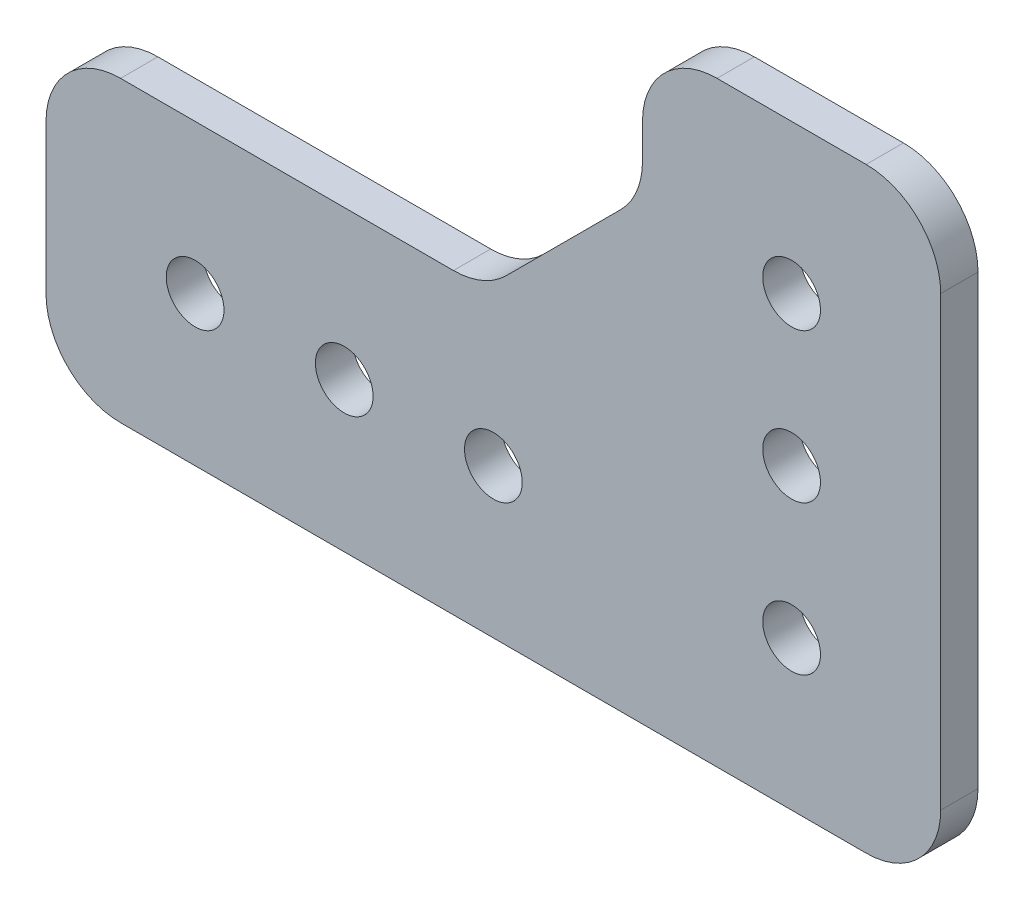
ISO-10303-21;
HEADER;
FILE_DESCRIPTION(('STEP AP214'),'2;1');
FILE_NAME('part.step','',(''),(''),'','','');
FILE_SCHEMA(('AUTOMOTIVE_DESIGN { 1 0 10303 214 1 1 1 1 }'));
ENDSEC;
DATA;
#1=APPLICATION_CONTEXT('core data for automotive mechanical design processes');
#2=APPLICATION_PROTOCOL_DEFINITION('international standard','automotive_design',2000,#1);
#3=PRODUCT_CONTEXT('',#1,'mechanical');
#4=PRODUCT('Part','Part','',(#3));
#5=PRODUCT_RELATED_PRODUCT_CATEGORY('part','',(#4));
#6=PRODUCT_DEFINITION_FORMATION('','',#4);
#7=PRODUCT_DEFINITION_CONTEXT('part definition',#1,'design');
#8=PRODUCT_DEFINITION('design','',#6,#7);
#9=PRODUCT_DEFINITION_SHAPE('','',#8);
#10=(LENGTH_UNIT() NAMED_UNIT(*) SI_UNIT(.MILLI.,.METRE.));
#11=(NAMED_UNIT(*) PLANE_ANGLE_UNIT() SI_UNIT($,.RADIAN.));
#12=(NAMED_UNIT(*) SI_UNIT($,.STERADIAN.) SOLID_ANGLE_UNIT());
#13=UNCERTAINTY_MEASURE_WITH_UNIT(LENGTH_MEASURE(1.E-05),#10,'distance_accuracy_value','');
#14=(GEOMETRIC_REPRESENTATION_CONTEXT(3) GLOBAL_UNCERTAINTY_ASSIGNED_CONTEXT((#13)) GLOBAL_UNIT_ASSIGNED_CONTEXT((#10,
#11,#12)) REPRESENTATION_CONTEXT('',''));
#15=CARTESIAN_POINT('',(0.,0.,0.));
#16=DIRECTION('',(0.,0.,1.));
#17=DIRECTION('',(1.,0.,0.));
#18=AXIS2_PLACEMENT_3D('',#15,#16,#17);
#19=CARTESIAN_POINT('',(-76.2,0.,3.175));
#20=DIRECTION('',(0.,1.,0.));
#21=DIRECTION('',(0.,0.,1.));
#22=AXIS2_PLACEMENT_3D('',#19,#20,#21);
#23=PLANE('',#22);
#24=DIRECTION('',(1.,0.,0.));
#25=VECTOR('',#24,1.);
#26=CARTESIAN_POINT('',(-76.2,0.,3.175));
#27=LINE('',#26,#25);
#28=CARTESIAN_POINT('',(-69.85,0.,3.175));
#29=VERTEX_POINT('',#28);
#30=CARTESIAN_POINT('',(-6.35000000000002,0.,3.175));
#31=VERTEX_POINT('',#30);
#32=EDGE_CURVE('E178',#29,#31,#27,.T.);
#33=ORIENTED_EDGE('',*,*,#32,.F.);
#34=DIRECTION('',(0.,0.,-1.));
#35=VECTOR('',#34,1.);
#36=CARTESIAN_POINT('',(-69.85,0.,3.175));
#37=LINE('',#36,#35);
#38=CARTESIAN_POINT('',(-69.85,0.,0.));
#39=VERTEX_POINT('',#38);
#40=EDGE_CURVE('E237',#29,#39,#37,.T.);
#41=ORIENTED_EDGE('',*,*,#40,.T.);
#42=DIRECTION('',(1.,0.,0.));
#43=VECTOR('',#42,1.);
#44=CARTESIAN_POINT('',(-76.2,0.,0.));
#45=LINE('',#44,#43);
#46=CARTESIAN_POINT('',(-6.35000000000002,0.,0.));
#47=VERTEX_POINT('',#46);
#48=EDGE_CURVE('E288',#39,#47,#45,.T.);
#49=ORIENTED_EDGE('',*,*,#48,.T.);
#50=DIRECTION('',(0.,0.,-1.));
#51=VECTOR('',#50,1.);
#52=CARTESIAN_POINT('',(-6.34999999999999,0.,3.175));
#53=LINE('',#52,#51);
#54=EDGE_CURVE('E234',#47,#31,#53,.F.);
#55=ORIENTED_EDGE('',*,*,#54,.T.);
#56=EDGE_LOOP('',(#33,#41,#49,#55));
#57=FACE_BOUND('',#56,.T.);
#58=ADVANCED_FACE('F39',(#57),#23,.F.);
#59=CARTESIAN_POINT('',(0.,0.,3.175));
#60=DIRECTION('',(-1.,0.,0.));
#61=DIRECTION('',(0.,0.,1.));
#62=AXIS2_PLACEMENT_3D('',#59,#60,#61);
#63=PLANE('',#62);
#64=DIRECTION('',(0.,1.,0.));
#65=VECTOR('',#64,1.);
#66=CARTESIAN_POINT('',(0.,0.,3.175));
#67=LINE('',#66,#65);
#68=CARTESIAN_POINT('',(0.,6.35,3.175));
#69=VERTEX_POINT('',#68);
#70=CARTESIAN_POINT('',(0.,44.45,3.175));
#71=VERTEX_POINT('',#70);
#72=EDGE_CURVE('E304',#69,#71,#67,.T.);
#73=ORIENTED_EDGE('',*,*,#72,.F.);
#74=DIRECTION('',(0.,0.,-1.));
#75=VECTOR('',#74,1.);
#76=CARTESIAN_POINT('',(0.,6.35,3.175));
#77=LINE('',#76,#75);
#78=CARTESIAN_POINT('',(0.,6.35,0.));
#79=VERTEX_POINT('',#78);
#80=EDGE_CURVE('E244',#69,#79,#77,.T.);
#81=ORIENTED_EDGE('',*,*,#80,.T.);
#82=DIRECTION('',(0.,1.,0.));
#83=VECTOR('',#82,1.);
#84=CARTESIAN_POINT('',(0.,0.,0.));
#85=LINE('',#84,#83);
#86=CARTESIAN_POINT('',(0.,44.45,0.));
#87=VERTEX_POINT('',#86);
#88=EDGE_CURVE('E292',#79,#87,#85,.T.);
#89=ORIENTED_EDGE('',*,*,#88,.T.);
#90=DIRECTION('',(0.,0.,-1.));
#91=VECTOR('',#90,1.);
#92=CARTESIAN_POINT('',(0.,44.45,3.175));
#93=LINE('',#92,#91);
#94=EDGE_CURVE('E241',#87,#71,#93,.F.);
#95=ORIENTED_EDGE('',*,*,#94,.T.);
#96=EDGE_LOOP('',(#73,#81,#89,#95));
#97=FACE_BOUND('',#96,.T.);
#98=ADVANCED_FACE('F390',(#97),#63,.F.);
#99=CARTESIAN_POINT('',(0.,50.8,3.175));
#100=DIRECTION('',(0.,-1.,0.));
#101=DIRECTION('',(0.,0.,-1.));
#102=AXIS2_PLACEMENT_3D('',#99,#100,#101);
#103=PLANE('',#102);
#104=DIRECTION('',(-1.,0.,0.));
#105=VECTOR('',#104,1.);
#106=CARTESIAN_POINT('',(0.,50.8,3.175));
#107=LINE('',#106,#105);
#108=CARTESIAN_POINT('',(-6.35,50.8,3.175));
#109=VERTEX_POINT('',#108);
#110=CARTESIAN_POINT('',(-19.05,50.8,3.175));
#111=VERTEX_POINT('',#110);
#112=EDGE_CURVE('E281',#109,#111,#107,.T.);
#113=ORIENTED_EDGE('',*,*,#112,.F.);
#114=DIRECTION('',(0.,0.,-1.));
#115=VECTOR('',#114,1.);
#116=CARTESIAN_POINT('',(-6.35,50.8,3.175));
#117=LINE('',#116,#115);
#118=CARTESIAN_POINT('',(-6.35,50.8,0.));
#119=VERTEX_POINT('',#118);
#120=EDGE_CURVE('E154',#109,#119,#117,.T.);
#121=ORIENTED_EDGE('',*,*,#120,.T.);
#122=DIRECTION('',(-1.,0.,0.));
#123=VECTOR('',#122,1.);
#124=CARTESIAN_POINT('',(0.,50.8,0.));
#125=LINE('',#124,#123);
#126=CARTESIAN_POINT('',(-19.05,50.8,0.));
#127=VERTEX_POINT('',#126);
#128=EDGE_CURVE('E266',#119,#127,#125,.T.);
#129=ORIENTED_EDGE('',*,*,#128,.T.);
#130=DIRECTION('',(0.,0.,-1.));
#131=VECTOR('',#130,1.);
#132=CARTESIAN_POINT('',(-19.05,50.8,3.175));
#133=LINE('',#132,#131);
#134=EDGE_CURVE('E55',#127,#111,#133,.F.);
#135=ORIENTED_EDGE('',*,*,#134,.T.);
#136=EDGE_LOOP('',(#113,#121,#129,#135));
#137=FACE_BOUND('',#136,.T.);
#138=ADVANCED_FACE('F299',(#137),#103,.F.);
#139=CARTESIAN_POINT('',(-25.4,50.8,3.175));
#140=DIRECTION('',(1.,0.,0.));
#141=DIRECTION('',(0.,1.,0.));
#142=AXIS2_PLACEMENT_3D('',#139,#140,#141);
#143=PLANE('',#142);
#144=DIRECTION('',(0.,-1.,0.));
#145=VECTOR('',#144,1.);
#146=CARTESIAN_POINT('',(-25.4,50.8,0.));
#147=LINE('',#146,#145);
#148=CARTESIAN_POINT('',(-25.4,44.45,0.));
#149=VERTEX_POINT('',#148);
#150=CARTESIAN_POINT('',(-25.4,41.5006403026729,0.));
#151=VERTEX_POINT('',#150);
#152=EDGE_CURVE('E180',#149,#151,#147,.T.);
#153=ORIENTED_EDGE('',*,*,#152,.T.);
#154=DIRECTION('',(0.,0.,-1.));
#155=VECTOR('',#154,1.);
#156=CARTESIAN_POINT('',(-25.4,41.5006403026729,3.175));
#157=LINE('',#156,#155);
#158=CARTESIAN_POINT('',(-25.4,41.5006403026729,3.175));
#159=VERTEX_POINT('',#158);
#160=EDGE_CURVE('E196',#151,#159,#157,.F.);
#161=ORIENTED_EDGE('',*,*,#160,.T.);
#162=DIRECTION('',(0.,-1.,0.));
#163=VECTOR('',#162,1.);
#164=CARTESIAN_POINT('',(-25.4,50.8,3.175));
#165=LINE('',#164,#163);
#166=CARTESIAN_POINT('',(-25.4,44.45,3.175));
#167=VERTEX_POINT('',#166);
#168=EDGE_CURVE('E273',#167,#159,#165,.T.);
#169=ORIENTED_EDGE('',*,*,#168,.F.);
#170=DIRECTION('',(0.,0.,-1.));
#171=VECTOR('',#170,1.);
#172=CARTESIAN_POINT('',(-25.4,44.45,3.175));
#173=LINE('',#172,#171);
#174=EDGE_CURVE('E192',#167,#149,#173,.T.);
#175=ORIENTED_EDGE('',*,*,#174,.T.);
#176=EDGE_LOOP('',(#153,#161,#169,#175));
#177=FACE_BOUND('',#176,.T.);
#178=ADVANCED_FACE('F261',(#177),#143,.F.);
#179=CARTESIAN_POINT('',(-25.4,38.8703841816037,3.175));
#180=DIRECTION('',(0.707106781186546,-0.707106781186549,0.));
#181=DIRECTION('',(0.707106781186549,0.707106781186546,0.));
#182=AXIS2_PLACEMENT_3D('',#179,#180,#181);
#183=PLANE('',#182);
#184=DIRECTION('',(-0.707106781186549,-0.707106781186546,0.));
#185=VECTOR('',#184,1.);
#186=CARTESIAN_POINT('',(-25.4,38.8703841816037,0.));
#187=LINE('',#186,#185);
#188=CARTESIAN_POINT('',(-27.2598719394654,37.0105122421383,0.));
#189=VERTEX_POINT('',#188);
#190=CARTESIAN_POINT('',(-37.0105122421383,27.2598719394654,0.));
#191=VERTEX_POINT('',#190);
#192=EDGE_CURVE('E173',#189,#191,#187,.T.);
#193=ORIENTED_EDGE('',*,*,#192,.T.);
#194=DIRECTION('',(0.,0.,-1.));
#195=VECTOR('',#194,1.);
#196=CARTESIAN_POINT('',(-37.0105122421383,27.2598719394654,3.175));
#197=LINE('',#196,#195);
#198=CARTESIAN_POINT('',(-37.0105122421383,27.2598719394654,3.175));
#199=VERTEX_POINT('',#198);
#200=EDGE_CURVE('E147',#191,#199,#197,.F.);
#201=ORIENTED_EDGE('',*,*,#200,.T.);
#202=DIRECTION('',(-0.707106781186549,-0.707106781186546,0.));
#203=VECTOR('',#202,1.);
#204=CARTESIAN_POINT('',(-25.4,38.8703841816037,3.175));
#205=LINE('',#204,#203);
#206=CARTESIAN_POINT('',(-27.2598719394654,37.0105122421383,3.175));
#207=VERTEX_POINT('',#206);
#208=EDGE_CURVE('E272',#207,#199,#205,.T.);
#209=ORIENTED_EDGE('',*,*,#208,.F.);
#210=DIRECTION('',(0.,0.,-1.));
#211=VECTOR('',#210,1.);
#212=CARTESIAN_POINT('',(-27.2598719394654,37.0105122421383,0.));
#213=LINE('',#212,#211);
#214=EDGE_CURVE('E165',#207,#189,#213,.T.);
#215=ORIENTED_EDGE('',*,*,#214,.T.);
#216=EDGE_LOOP('',(#193,#201,#209,#215));
#217=FACE_BOUND('',#216,.T.);
#218=ADVANCED_FACE('F275',(#217),#183,.F.);
#219=CARTESIAN_POINT('',(-38.8703841816037,25.4,3.175));
#220=DIRECTION('',(0.,-1.,0.));
#221=DIRECTION('',(1.,0.,0.));
#222=AXIS2_PLACEMENT_3D('',#219,#220,#221);
#223=PLANE('',#222);
#224=DIRECTION('',(-1.,0.,0.));
#225=VECTOR('',#224,1.);
#226=CARTESIAN_POINT('',(-38.8703841816037,25.4,3.175));
#227=LINE('',#226,#225);
#228=CARTESIAN_POINT('',(-41.5006403026729,25.4,3.175));
#229=VERTEX_POINT('',#228);
#230=CARTESIAN_POINT('',(-69.85,25.4,3.175));
#231=VERTEX_POINT('',#230);
#232=EDGE_CURVE('E163',#229,#231,#227,.T.);
#233=ORIENTED_EDGE('',*,*,#232,.F.);
#234=DIRECTION('',(0.,0.,-1.));
#235=VECTOR('',#234,1.);
#236=CARTESIAN_POINT('',(-41.5006403026729,25.4,0.));
#237=LINE('',#236,#235);
#238=CARTESIAN_POINT('',(-41.5006403026729,25.4,0.));
#239=VERTEX_POINT('',#238);
#240=EDGE_CURVE('E146',#229,#239,#237,.T.);
#241=ORIENTED_EDGE('',*,*,#240,.T.);
#242=DIRECTION('',(-1.,0.,0.));
#243=VECTOR('',#242,1.);
#244=CARTESIAN_POINT('',(-38.8703841816037,25.4,0.));
#245=LINE('',#244,#243);
#246=CARTESIAN_POINT('',(-69.85,25.4,0.));
#247=VERTEX_POINT('',#246);
#248=EDGE_CURVE('E160',#239,#247,#245,.T.);
#249=ORIENTED_EDGE('',*,*,#248,.T.);
#250=DIRECTION('',(0.,0.,-1.));
#251=VECTOR('',#250,1.);
#252=CARTESIAN_POINT('',(-69.85,25.4,3.175));
#253=LINE('',#252,#251);
#254=EDGE_CURVE('E166',#247,#231,#253,.F.);
#255=ORIENTED_EDGE('',*,*,#254,.T.);
#256=EDGE_LOOP('',(#233,#241,#249,#255));
#257=FACE_BOUND('',#256,.T.);
#258=ADVANCED_FACE('F159',(#257),#223,.F.);
#259=CARTESIAN_POINT('',(-76.2,25.4,3.175));
#260=DIRECTION('',(1.,0.,0.));
#261=DIRECTION('',(0.,0.,-1.));
#262=AXIS2_PLACEMENT_3D('',#259,#260,#261);
#263=PLANE('',#262);
#264=DIRECTION('',(0.,-1.,0.));
#265=VECTOR('',#264,1.);
#266=CARTESIAN_POINT('',(-76.2,25.4,3.175));
#267=LINE('',#266,#265);
#268=CARTESIAN_POINT('',(-76.2,19.05,3.175));
#269=VERTEX_POINT('',#268);
#270=CARTESIAN_POINT('',(-76.2,6.35,3.175));
#271=VERTEX_POINT('',#270);
#272=EDGE_CURVE('E185',#269,#271,#267,.T.);
#273=ORIENTED_EDGE('',*,*,#272,.F.);
#274=DIRECTION('',(0.,0.,-1.));
#275=VECTOR('',#274,1.);
#276=CARTESIAN_POINT('',(-76.2,19.05,3.175));
#277=LINE('',#276,#275);
#278=CARTESIAN_POINT('',(-76.2,19.05,0.));
#279=VERTEX_POINT('',#278);
#280=EDGE_CURVE('E202',#269,#279,#277,.T.);
#281=ORIENTED_EDGE('',*,*,#280,.T.);
#282=DIRECTION('',(0.,-1.,0.));
#283=VECTOR('',#282,1.);
#284=CARTESIAN_POINT('',(-76.2,25.4,0.));
#285=LINE('',#284,#283);
#286=CARTESIAN_POINT('',(-76.2,6.35,0.));
#287=VERTEX_POINT('',#286);
#288=EDGE_CURVE('E172',#279,#287,#285,.T.);
#289=ORIENTED_EDGE('',*,*,#288,.T.);
#290=DIRECTION('',(0.,0.,-1.));
#291=VECTOR('',#290,1.);
#292=CARTESIAN_POINT('',(-76.2,6.35,3.175));
#293=LINE('',#292,#291);
#294=EDGE_CURVE('E199',#287,#271,#293,.F.);
#295=ORIENTED_EDGE('',*,*,#294,.T.);
#296=EDGE_LOOP('',(#273,#281,#289,#295));
#297=FACE_BOUND('',#296,.T.);
#298=ADVANCED_FACE('F363',(#297),#263,.F.);
#299=CARTESIAN_POINT('',(0.,0.,3.175));
#300=DIRECTION('',(0.,0.,1.));
#301=DIRECTION('',(1.,0.,0.));
#302=AXIS2_PLACEMENT_3D('',#299,#300,#301);
#303=PLANE('',#302);
#304=CARTESIAN_POINT('',(-63.5,12.7,3.175));
#305=DIRECTION('',(0.,0.,1.));
#306=DIRECTION('',(1.,0.,0.));
#307=AXIS2_PLACEMENT_3D('',#304,#305,#306);
#308=CIRCLE('',#307,2.45744999999999);
#309=CARTESIAN_POINT('',(-61.04255,12.7,3.175));
#310=VERTEX_POINT('',#309);
#311=EDGE_CURVE('E354',#310,#310,#308,.T.);
#312=ORIENTED_EDGE('',*,*,#311,.F.);
#313=EDGE_LOOP('',(#312));
#314=FACE_BOUND('',#313,.T.);
#315=CARTESIAN_POINT('',(-50.8,12.7,3.175));
#316=DIRECTION('',(0.,0.,1.));
#317=DIRECTION('',(1.,0.,0.));
#318=AXIS2_PLACEMENT_3D('',#315,#316,#317);
#319=CIRCLE('',#318,2.45744999999999);
#320=CARTESIAN_POINT('',(-48.34255,12.7,3.175));
#321=VERTEX_POINT('',#320);
#322=EDGE_CURVE('E346',#321,#321,#319,.T.);
#323=ORIENTED_EDGE('',*,*,#322,.F.);
#324=EDGE_LOOP('',(#323));
#325=FACE_BOUND('',#324,.T.);
#326=CARTESIAN_POINT('',(-12.7,25.4,3.175));
#327=DIRECTION('',(0.,0.,1.));
#328=DIRECTION('',(1.,0.,0.));
#329=AXIS2_PLACEMENT_3D('',#326,#327,#328);
#330=CIRCLE('',#329,2.45744999999999);
#331=CARTESIAN_POINT('',(-10.24255,25.4,3.175));
#332=VERTEX_POINT('',#331);
#333=EDGE_CURVE('E338',#332,#332,#330,.T.);
#334=ORIENTED_EDGE('',*,*,#333,.F.);
#335=EDGE_LOOP('',(#334));
#336=FACE_BOUND('',#335,.T.);
#337=CARTESIAN_POINT('',(-12.7,38.1,3.175));
#338=DIRECTION('',(0.,0.,1.));
#339=DIRECTION('',(1.,0.,0.));
#340=AXIS2_PLACEMENT_3D('',#337,#338,#339);
#341=CIRCLE('',#340,2.45744999999999);
#342=CARTESIAN_POINT('',(-10.24255,38.1,3.175));
#343=VERTEX_POINT('',#342);
#344=EDGE_CURVE('E330',#343,#343,#341,.T.);
#345=ORIENTED_EDGE('',*,*,#344,.F.);
#346=EDGE_LOOP('',(#345));
#347=FACE_BOUND('',#346,.T.);
#348=CARTESIAN_POINT('',(-38.1,12.7,3.175));
#349=DIRECTION('',(0.,0.,1.));
#350=DIRECTION('',(1.,0.,0.));
#351=AXIS2_PLACEMENT_3D('',#348,#349,#350);
#352=CIRCLE('',#351,2.45744999999999);
#353=CARTESIAN_POINT('',(-35.64255,12.7,3.175));
#354=VERTEX_POINT('',#353);
#355=EDGE_CURVE('E322',#354,#354,#352,.T.);
#356=ORIENTED_EDGE('',*,*,#355,.F.);
#357=EDGE_LOOP('',(#356));
#358=FACE_BOUND('',#357,.T.);
#359=CARTESIAN_POINT('',(-12.7,12.7,3.175));
#360=DIRECTION('',(0.,0.,1.));
#361=DIRECTION('',(1.,0.,0.));
#362=AXIS2_PLACEMENT_3D('',#359,#360,#361);
#363=CIRCLE('',#362,2.45744999999999);
#364=CARTESIAN_POINT('',(-10.24255,12.7,3.175));
#365=VERTEX_POINT('',#364);
#366=EDGE_CURVE('E314',#365,#365,#363,.T.);
#367=ORIENTED_EDGE('',*,*,#366,.F.);
#368=EDGE_LOOP('',(#367));
#369=FACE_BOUND('',#368,.T.);
#370=ORIENTED_EDGE('',*,*,#232,.T.);
#371=CARTESIAN_POINT('',(-69.85,19.05,3.175));
#372=DIRECTION('',(0.,0.,1.));
#373=DIRECTION('',(1.,0.,0.));
#374=AXIS2_PLACEMENT_3D('',#371,#372,#373);
#375=CIRCLE('',#374,6.35);
#376=EDGE_CURVE('E231',#231,#269,#375,.T.);
#377=ORIENTED_EDGE('',*,*,#376,.T.);
#378=ORIENTED_EDGE('',*,*,#272,.T.);
#379=CARTESIAN_POINT('',(-69.85,6.35,3.175));
#380=DIRECTION('',(0.,0.,1.));
#381=DIRECTION('',(1.,0.,0.));
#382=AXIS2_PLACEMENT_3D('',#379,#380,#381);
#383=CIRCLE('',#382,6.35);
#384=EDGE_CURVE('E228',#271,#29,#383,.T.);
#385=ORIENTED_EDGE('',*,*,#384,.T.);
#386=ORIENTED_EDGE('',*,*,#32,.T.);
#387=CARTESIAN_POINT('',(-6.35,6.35,3.175));
#388=DIRECTION('',(0.,0.,1.));
#389=DIRECTION('',(1.,0.,0.));
#390=AXIS2_PLACEMENT_3D('',#387,#388,#389);
#391=CIRCLE('',#390,6.35);
#392=EDGE_CURVE('E225',#31,#69,#391,.T.);
#393=ORIENTED_EDGE('',*,*,#392,.T.);
#394=ORIENTED_EDGE('',*,*,#72,.T.);
#395=CARTESIAN_POINT('',(-6.35,44.45,3.175));
#396=DIRECTION('',(0.,0.,1.));
#397=DIRECTION('',(1.,0.,0.));
#398=AXIS2_PLACEMENT_3D('',#395,#396,#397);
#399=CIRCLE('',#398,6.35);
#400=EDGE_CURVE('E62',#71,#109,#399,.T.);
#401=ORIENTED_EDGE('',*,*,#400,.T.);
#402=ORIENTED_EDGE('',*,*,#112,.T.);
#403=CARTESIAN_POINT('',(-19.05,44.45,3.175));
#404=DIRECTION('',(0.,0.,1.));
#405=DIRECTION('',(1.,0.,0.));
#406=AXIS2_PLACEMENT_3D('',#403,#404,#405);
#407=CIRCLE('',#406,6.35);
#408=EDGE_CURVE('E220',#111,#167,#407,.T.);
#409=ORIENTED_EDGE('',*,*,#408,.T.);
#410=ORIENTED_EDGE('',*,*,#168,.T.);
#411=CARTESIAN_POINT('',(-31.75,41.5006403026729,3.175));
#412=DIRECTION('',(0.,0.,1.));
#413=DIRECTION('',(1.,0.,0.));
#414=AXIS2_PLACEMENT_3D('',#411,#412,#413);
#415=CIRCLE('',#414,6.35);
#416=EDGE_CURVE('E11',#159,#207,#415,.F.);
#417=ORIENTED_EDGE('',*,*,#416,.T.);
#418=ORIENTED_EDGE('',*,*,#208,.T.);
#419=CARTESIAN_POINT('',(-41.5006403026729,31.75,3.175));
#420=DIRECTION('',(0.,0.,1.));
#421=DIRECTION('',(1.,0.,0.));
#422=AXIS2_PLACEMENT_3D('',#419,#420,#421);
#423=CIRCLE('',#422,6.35);
#424=EDGE_CURVE('E153',#199,#229,#423,.F.);
#425=ORIENTED_EDGE('',*,*,#424,.T.);
#426=EDGE_LOOP('',(#370,#377,#378,#385,#386,#393,#394,#401,#402,#409,#410,#417,#418,#425));
#427=FACE_BOUND('',#426,.T.);
#428=ADVANCED_FACE('F271',(#314,#325,#336,#347,#358,#369,#427),#303,.T.);
#429=CARTESIAN_POINT('',(0.,0.,0.));
#430=DIRECTION('',(0.,0.,1.));
#431=DIRECTION('',(1.,0.,0.));
#432=AXIS2_PLACEMENT_3D('',#429,#430,#431);
#433=PLANE('',#432);
#434=CARTESIAN_POINT('',(-63.5,12.7,0.));
#435=DIRECTION('',(0.,0.,1.));
#436=DIRECTION('',(1.,0.,0.));
#437=AXIS2_PLACEMENT_3D('',#434,#435,#436);
#438=CIRCLE('',#437,2.45744999999999);
#439=CARTESIAN_POINT('',(-61.04255,12.7,0.));
#440=VERTEX_POINT('',#439);
#441=EDGE_CURVE('E350',#440,#440,#438,.T.);
#442=ORIENTED_EDGE('',*,*,#441,.T.);
#443=EDGE_LOOP('',(#442));
#444=FACE_BOUND('',#443,.T.);
#445=CARTESIAN_POINT('',(-50.8,12.7,0.));
#446=DIRECTION('',(0.,0.,1.));
#447=DIRECTION('',(1.,0.,0.));
#448=AXIS2_PLACEMENT_3D('',#445,#446,#447);
#449=CIRCLE('',#448,2.45744999999999);
#450=CARTESIAN_POINT('',(-48.34255,12.7,0.));
#451=VERTEX_POINT('',#450);
#452=EDGE_CURVE('E342',#451,#451,#449,.T.);
#453=ORIENTED_EDGE('',*,*,#452,.T.);
#454=EDGE_LOOP('',(#453));
#455=FACE_BOUND('',#454,.T.);
#456=CARTESIAN_POINT('',(-12.7,25.4,0.));
#457=DIRECTION('',(0.,0.,1.));
#458=DIRECTION('',(1.,0.,0.));
#459=AXIS2_PLACEMENT_3D('',#456,#457,#458);
#460=CIRCLE('',#459,2.45744999999999);
#461=CARTESIAN_POINT('',(-10.24255,25.4,0.));
#462=VERTEX_POINT('',#461);
#463=EDGE_CURVE('E334',#462,#462,#460,.T.);
#464=ORIENTED_EDGE('',*,*,#463,.T.);
#465=EDGE_LOOP('',(#464));
#466=FACE_BOUND('',#465,.T.);
#467=CARTESIAN_POINT('',(-12.7,38.1,0.));
#468=DIRECTION('',(0.,0.,1.));
#469=DIRECTION('',(1.,0.,0.));
#470=AXIS2_PLACEMENT_3D('',#467,#468,#469);
#471=CIRCLE('',#470,2.45744999999999);
#472=CARTESIAN_POINT('',(-10.24255,38.1,0.));
#473=VERTEX_POINT('',#472);
#474=EDGE_CURVE('E326',#473,#473,#471,.T.);
#475=ORIENTED_EDGE('',*,*,#474,.T.);
#476=EDGE_LOOP('',(#475));
#477=FACE_BOUND('',#476,.T.);
#478=CARTESIAN_POINT('',(-38.1,12.7,0.));
#479=DIRECTION('',(0.,0.,1.));
#480=DIRECTION('',(1.,0.,0.));
#481=AXIS2_PLACEMENT_3D('',#478,#479,#480);
#482=CIRCLE('',#481,2.45744999999999);
#483=CARTESIAN_POINT('',(-35.64255,12.7,0.));
#484=VERTEX_POINT('',#483);
#485=EDGE_CURVE('E318',#484,#484,#482,.T.);
#486=ORIENTED_EDGE('',*,*,#485,.T.);
#487=EDGE_LOOP('',(#486));
#488=FACE_BOUND('',#487,.T.);
#489=CARTESIAN_POINT('',(-12.7,12.7,0.));
#490=DIRECTION('',(0.,0.,1.));
#491=DIRECTION('',(1.,0.,0.));
#492=AXIS2_PLACEMENT_3D('',#489,#490,#491);
#493=CIRCLE('',#492,2.45744999999999);
#494=CARTESIAN_POINT('',(-10.24255,12.7,0.));
#495=VERTEX_POINT('',#494);
#496=EDGE_CURVE('E293',#495,#495,#493,.T.);
#497=ORIENTED_EDGE('',*,*,#496,.T.);
#498=EDGE_LOOP('',(#497));
#499=FACE_BOUND('',#498,.T.);
#500=ORIENTED_EDGE('',*,*,#288,.F.);
#501=CARTESIAN_POINT('',(-69.85,19.05,0.));
#502=DIRECTION('',(0.,0.,1.));
#503=DIRECTION('',(1.,0.,0.));
#504=AXIS2_PLACEMENT_3D('',#501,#502,#503);
#505=CIRCLE('',#504,6.35);
#506=EDGE_CURVE('E170',#279,#247,#505,.F.);
#507=ORIENTED_EDGE('',*,*,#506,.T.);
#508=ORIENTED_EDGE('',*,*,#248,.F.);
#509=CARTESIAN_POINT('',(-41.5006403026729,31.75,0.));
#510=DIRECTION('',(0.,0.,1.));
#511=DIRECTION('',(1.,0.,0.));
#512=AXIS2_PLACEMENT_3D('',#509,#510,#511);
#513=CIRCLE('',#512,6.35);
#514=EDGE_CURVE('E142',#239,#191,#513,.T.);
#515=ORIENTED_EDGE('',*,*,#514,.T.);
#516=ORIENTED_EDGE('',*,*,#192,.F.);
#517=CARTESIAN_POINT('',(-31.75,41.5006403026729,0.));
#518=DIRECTION('',(0.,0.,1.));
#519=DIRECTION('',(1.,0.,0.));
#520=AXIS2_PLACEMENT_3D('',#517,#518,#519);
#521=CIRCLE('',#520,6.35);
#522=EDGE_CURVE('E48',#189,#151,#521,.T.);
#523=ORIENTED_EDGE('',*,*,#522,.T.);
#524=ORIENTED_EDGE('',*,*,#152,.F.);
#525=CARTESIAN_POINT('',(-19.05,44.45,0.));
#526=DIRECTION('',(0.,0.,1.));
#527=DIRECTION('',(1.,0.,0.));
#528=AXIS2_PLACEMENT_3D('',#525,#526,#527);
#529=CIRCLE('',#528,6.35);
#530=EDGE_CURVE('E206',#149,#127,#529,.F.);
#531=ORIENTED_EDGE('',*,*,#530,.T.);
#532=ORIENTED_EDGE('',*,*,#128,.F.);
#533=CARTESIAN_POINT('',(-6.35,44.45,0.));
#534=DIRECTION('',(0.,0.,1.));
#535=DIRECTION('',(1.,0.,0.));
#536=AXIS2_PLACEMENT_3D('',#533,#534,#535);
#537=CIRCLE('',#536,6.35);
#538=EDGE_CURVE('E209',#119,#87,#537,.F.);
#539=ORIENTED_EDGE('',*,*,#538,.T.);
#540=ORIENTED_EDGE('',*,*,#88,.F.);
#541=CARTESIAN_POINT('',(-6.35,6.35,0.));
#542=DIRECTION('',(0.,0.,1.));
#543=DIRECTION('',(1.,0.,0.));
#544=AXIS2_PLACEMENT_3D('',#541,#542,#543);
#545=CIRCLE('',#544,6.35);
#546=EDGE_CURVE('E212',#79,#47,#545,.F.);
#547=ORIENTED_EDGE('',*,*,#546,.T.);
#548=ORIENTED_EDGE('',*,*,#48,.F.);
#549=CARTESIAN_POINT('',(-69.85,6.35,0.));
#550=DIRECTION('',(0.,0.,1.));
#551=DIRECTION('',(1.,0.,0.));
#552=AXIS2_PLACEMENT_3D('',#549,#550,#551);
#553=CIRCLE('',#552,6.35);
#554=EDGE_CURVE('E215',#39,#287,#553,.F.);
#555=ORIENTED_EDGE('',*,*,#554,.T.);
#556=EDGE_LOOP('',(#500,#507,#508,#515,#516,#523,#524,#531,#532,#539,#540,#547,#548,#555));
#557=FACE_BOUND('',#556,.T.);
#558=ADVANCED_FACE('F169',(#444,#455,#466,#477,#488,#499,#557),#433,.F.);
#559=CARTESIAN_POINT('',(-41.5006403026729,31.75,3.175));
#560=DIRECTION('',(0.,0.,1.));
#561=DIRECTION('',(1.,0.,0.));
#562=AXIS2_PLACEMENT_3D('',#559,#560,#561);
#563=CYLINDRICAL_SURFACE('',#562,6.35);
#564=ORIENTED_EDGE('',*,*,#424,.F.);
#565=ORIENTED_EDGE('',*,*,#200,.F.);
#566=ORIENTED_EDGE('',*,*,#514,.F.);
#567=ORIENTED_EDGE('',*,*,#240,.F.);
#568=EDGE_LOOP('',(#564,#565,#566,#567));
#569=FACE_BOUND('',#568,.T.);
#570=ADVANCED_FACE('F145',(#569),#563,.F.);
#571=CARTESIAN_POINT('',(-31.75,41.5006403026729,3.175));
#572=DIRECTION('',(0.,0.,1.));
#573=DIRECTION('',(1.,0.,0.));
#574=AXIS2_PLACEMENT_3D('',#571,#572,#573);
#575=CYLINDRICAL_SURFACE('',#574,6.35);
#576=ORIENTED_EDGE('',*,*,#416,.F.);
#577=ORIENTED_EDGE('',*,*,#160,.F.);
#578=ORIENTED_EDGE('',*,*,#522,.F.);
#579=ORIENTED_EDGE('',*,*,#214,.F.);
#580=EDGE_LOOP('',(#576,#577,#578,#579));
#581=FACE_BOUND('',#580,.T.);
#582=ADVANCED_FACE('F268',(#581),#575,.F.);
#583=CARTESIAN_POINT('',(-69.85,19.05,3.175));
#584=DIRECTION('',(0.,0.,-1.));
#585=DIRECTION('',(-1.,0.,0.));
#586=AXIS2_PLACEMENT_3D('',#583,#584,#585);
#587=CYLINDRICAL_SURFACE('',#586,6.35);
#588=ORIENTED_EDGE('',*,*,#376,.F.);
#589=ORIENTED_EDGE('',*,*,#254,.F.);
#590=ORIENTED_EDGE('',*,*,#506,.F.);
#591=ORIENTED_EDGE('',*,*,#280,.F.);
#592=EDGE_LOOP('',(#588,#589,#590,#591));
#593=FACE_BOUND('',#592,.T.);
#594=ADVANCED_FACE('F405',(#593),#587,.T.);
#595=CARTESIAN_POINT('',(-69.85,6.35,3.175));
#596=DIRECTION('',(0.,0.,-1.));
#597=DIRECTION('',(-1.,0.,0.));
#598=AXIS2_PLACEMENT_3D('',#595,#596,#597);
#599=CYLINDRICAL_SURFACE('',#598,6.35);
#600=ORIENTED_EDGE('',*,*,#384,.F.);
#601=ORIENTED_EDGE('',*,*,#294,.F.);
#602=ORIENTED_EDGE('',*,*,#554,.F.);
#603=ORIENTED_EDGE('',*,*,#40,.F.);
#604=EDGE_LOOP('',(#600,#601,#602,#603));
#605=FACE_BOUND('',#604,.T.);
#606=ADVANCED_FACE('F408',(#605),#599,.T.);
#607=CARTESIAN_POINT('',(-6.35,6.35,3.175));
#608=DIRECTION('',(0.,0.,-1.));
#609=DIRECTION('',(-1.,0.,0.));
#610=AXIS2_PLACEMENT_3D('',#607,#608,#609);
#611=CYLINDRICAL_SURFACE('',#610,6.35);
#612=ORIENTED_EDGE('',*,*,#392,.F.);
#613=ORIENTED_EDGE('',*,*,#54,.F.);
#614=ORIENTED_EDGE('',*,*,#546,.F.);
#615=ORIENTED_EDGE('',*,*,#80,.F.);
#616=EDGE_LOOP('',(#612,#613,#614,#615));
#617=FACE_BOUND('',#616,.T.);
#618=ADVANCED_FACE('F412',(#617),#611,.T.);
#619=CARTESIAN_POINT('',(-6.35,44.45,3.175));
#620=DIRECTION('',(0.,0.,-1.));
#621=DIRECTION('',(-1.,0.,0.));
#622=AXIS2_PLACEMENT_3D('',#619,#620,#621);
#623=CYLINDRICAL_SURFACE('',#622,6.35);
#624=ORIENTED_EDGE('',*,*,#400,.F.);
#625=ORIENTED_EDGE('',*,*,#94,.F.);
#626=ORIENTED_EDGE('',*,*,#538,.F.);
#627=ORIENTED_EDGE('',*,*,#120,.F.);
#628=EDGE_LOOP('',(#624,#625,#626,#627));
#629=FACE_BOUND('',#628,.T.);
#630=ADVANCED_FACE('F387',(#629),#623,.T.);
#631=CARTESIAN_POINT('',(-19.05,44.45,3.175));
#632=DIRECTION('',(0.,0.,-1.));
#633=DIRECTION('',(-1.,0.,0.));
#634=AXIS2_PLACEMENT_3D('',#631,#632,#633);
#635=CYLINDRICAL_SURFACE('',#634,6.35);
#636=ORIENTED_EDGE('',*,*,#408,.F.);
#637=ORIENTED_EDGE('',*,*,#134,.F.);
#638=ORIENTED_EDGE('',*,*,#530,.F.);
#639=ORIENTED_EDGE('',*,*,#174,.F.);
#640=EDGE_LOOP('',(#636,#637,#638,#639));
#641=FACE_BOUND('',#640,.T.);
#642=ADVANCED_FACE('F41',(#641),#635,.T.);
#643=CARTESIAN_POINT('',(-12.7,12.7,3.175));
#644=DIRECTION('',(0.,0.,1.));
#645=DIRECTION('',(1.,0.,0.));
#646=AXIS2_PLACEMENT_3D('',#643,#644,#645);
#647=CYLINDRICAL_SURFACE('',#646,2.45744999999999);
#648=ORIENTED_EDGE('',*,*,#496,.F.);
#649=EDGE_LOOP('',(#648));
#650=FACE_BOUND('',#649,.T.);
#651=ORIENTED_EDGE('',*,*,#366,.T.);
#652=EDGE_LOOP('',(#651));
#653=FACE_BOUND('',#652,.T.);
#654=ADVANCED_FACE('F375',(#650,#653),#647,.F.);
#655=CARTESIAN_POINT('',(-38.1,12.7,3.175));
#656=DIRECTION('',(0.,0.,1.));
#657=DIRECTION('',(1.,0.,0.));
#658=AXIS2_PLACEMENT_3D('',#655,#656,#657);
#659=CYLINDRICAL_SURFACE('',#658,2.45744999999999);
#660=ORIENTED_EDGE('',*,*,#485,.F.);
#661=EDGE_LOOP('',(#660));
#662=FACE_BOUND('',#661,.T.);
#663=ORIENTED_EDGE('',*,*,#355,.T.);
#664=EDGE_LOOP('',(#663));
#665=FACE_BOUND('',#664,.T.);
#666=ADVANCED_FACE('F377',(#662,#665),#659,.F.);
#667=CARTESIAN_POINT('',(-12.7,38.1,3.175));
#668=DIRECTION('',(0.,0.,1.));
#669=DIRECTION('',(1.,0.,0.));
#670=AXIS2_PLACEMENT_3D('',#667,#668,#669);
#671=CYLINDRICAL_SURFACE('',#670,2.45744999999999);
#672=ORIENTED_EDGE('',*,*,#474,.F.);
#673=EDGE_LOOP('',(#672));
#674=FACE_BOUND('',#673,.T.);
#675=ORIENTED_EDGE('',*,*,#344,.T.);
#676=EDGE_LOOP('',(#675));
#677=FACE_BOUND('',#676,.T.);
#678=ADVANCED_FACE('F384',(#674,#677),#671,.F.);
#679=CARTESIAN_POINT('',(-12.7,25.4,3.175));
#680=DIRECTION('',(0.,0.,1.));
#681=DIRECTION('',(1.,0.,0.));
#682=AXIS2_PLACEMENT_3D('',#679,#680,#681);
#683=CYLINDRICAL_SURFACE('',#682,2.45744999999999);
#684=ORIENTED_EDGE('',*,*,#463,.F.);
#685=EDGE_LOOP('',(#684));
#686=FACE_BOUND('',#685,.T.);
#687=ORIENTED_EDGE('',*,*,#333,.T.);
#688=EDGE_LOOP('',(#687));
#689=FACE_BOUND('',#688,.T.);
#690=ADVANCED_FACE('F539',(#686,#689),#683,.F.);
#691=CARTESIAN_POINT('',(-50.8,12.7,3.175));
#692=DIRECTION('',(0.,0.,1.));
#693=DIRECTION('',(1.,0.,0.));
#694=AXIS2_PLACEMENT_3D('',#691,#692,#693);
#695=CYLINDRICAL_SURFACE('',#694,2.45744999999999);
#696=ORIENTED_EDGE('',*,*,#452,.F.);
#697=EDGE_LOOP('',(#696));
#698=FACE_BOUND('',#697,.T.);
#699=ORIENTED_EDGE('',*,*,#322,.T.);
#700=EDGE_LOOP('',(#699));
#701=FACE_BOUND('',#700,.T.);
#702=ADVANCED_FACE('F549',(#698,#701),#695,.F.);
#703=CARTESIAN_POINT('',(-63.5,12.7,3.175));
#704=DIRECTION('',(0.,0.,1.));
#705=DIRECTION('',(1.,0.,0.));
#706=AXIS2_PLACEMENT_3D('',#703,#704,#705);
#707=CYLINDRICAL_SURFACE('',#706,2.45744999999999);
#708=ORIENTED_EDGE('',*,*,#441,.F.);
#709=EDGE_LOOP('',(#708));
#710=FACE_BOUND('',#709,.T.);
#711=ORIENTED_EDGE('',*,*,#311,.T.);
#712=EDGE_LOOP('',(#711));
#713=FACE_BOUND('',#712,.T.);
#714=ADVANCED_FACE('F359',(#710,#713),#707,.F.);
#715=CLOSED_SHELL('',(#58,#98,#138,#178,#218,#258,#298,#428,#558,#570,#582,#594,#606,#618,#630,
#642,#654,#666,#678,#690,#702,#714));
#716=MANIFOLD_SOLID_BREP('B2',#715);
#717=ADVANCED_BREP_SHAPE_REPRESENTATION('',(#18,#716),#14);
#718=SHAPE_DEFINITION_REPRESENTATION(#9,#717);
ENDSEC;
END-ISO-10303-21;
